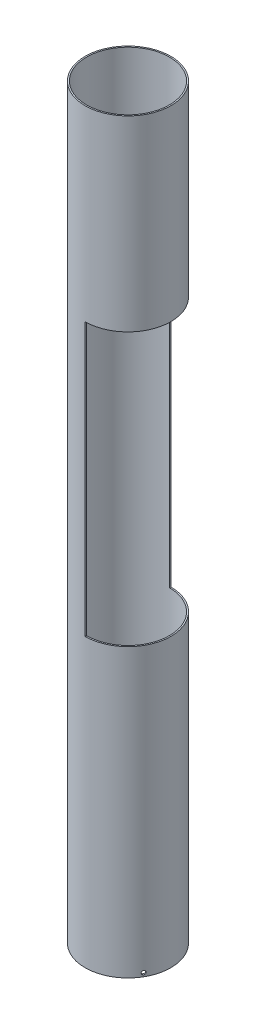
ISO-10303-21;
HEADER;
FILE_DESCRIPTION(('STEP AP214'),'2;1');
FILE_NAME('part.step','',(''),(''),'','','');
FILE_SCHEMA(('AUTOMOTIVE_DESIGN { 1 0 10303 214 1 1 1 1 }'));
ENDSEC;
DATA;
#1=APPLICATION_CONTEXT('core data for automotive mechanical design processes');
#2=APPLICATION_PROTOCOL_DEFINITION('international standard','automotive_design',2000,#1);
#3=PRODUCT_CONTEXT('',#1,'mechanical');
#4=PRODUCT('Part','Part','',(#3));
#5=PRODUCT_RELATED_PRODUCT_CATEGORY('part','',(#4));
#6=PRODUCT_DEFINITION_FORMATION('','',#4);
#7=PRODUCT_DEFINITION_CONTEXT('part definition',#1,'design');
#8=PRODUCT_DEFINITION('design','',#6,#7);
#9=PRODUCT_DEFINITION_SHAPE('','',#8);
#10=(LENGTH_UNIT() NAMED_UNIT(*) SI_UNIT(.MILLI.,.METRE.));
#11=(NAMED_UNIT(*) PLANE_ANGLE_UNIT() SI_UNIT($,.RADIAN.));
#12=(NAMED_UNIT(*) SI_UNIT($,.STERADIAN.) SOLID_ANGLE_UNIT());
#13=UNCERTAINTY_MEASURE_WITH_UNIT(LENGTH_MEASURE(1.E-05),#10,'distance_accuracy_value','');
#14=(GEOMETRIC_REPRESENTATION_CONTEXT(3) GLOBAL_UNCERTAINTY_ASSIGNED_CONTEXT((#13)) GLOBAL_UNIT_ASSIGNED_CONTEXT((#10,
#11,#12)) REPRESENTATION_CONTEXT('',''));
#15=CARTESIAN_POINT('',(0.,0.,0.));
#16=DIRECTION('',(0.,0.,1.));
#17=DIRECTION('',(1.,0.,0.));
#18=AXIS2_PLACEMENT_3D('',#15,#16,#17);
#19=CARTESIAN_POINT('',(0.,685.8,0.));
#20=DIRECTION('',(0.,-1.,0.));
#21=DIRECTION('',(0.,0.,-1.));
#22=AXIS2_PLACEMENT_3D('',#19,#20,#21);
#23=CYLINDRICAL_SURFACE('',#22,39.37);
#24=CARTESIAN_POINT('',(0.,0.,0.));
#25=DIRECTION('',(0.,1.,0.));
#26=DIRECTION('',(0.,0.,1.));
#27=AXIS2_PLACEMENT_3D('',#24,#25,#26);
#28=CIRCLE('',#27,39.37);
#29=CARTESIAN_POINT('',(0.,0.,39.37));
#30=VERTEX_POINT('',#29);
#31=EDGE_CURVE('E171',#30,#30,#28,.T.);
#32=ORIENTED_EDGE('',*,*,#31,.T.);
#33=EDGE_LOOP('',(#32));
#34=FACE_BOUND('',#33,.T.);
#35=CARTESIAN_POINT('',(0.,685.8,0.));
#36=DIRECTION('',(0.,1.,0.));
#37=DIRECTION('',(0.,0.,1.));
#38=AXIS2_PLACEMENT_3D('',#35,#36,#37);
#39=CIRCLE('',#38,39.37);
#40=CARTESIAN_POINT('',(0.,685.8,39.37));
#41=VERTEX_POINT('',#40);
#42=EDGE_CURVE('E175',#41,#41,#39,.T.);
#43=ORIENTED_EDGE('',*,*,#42,.F.);
#44=EDGE_LOOP('',(#43));
#45=FACE_BOUND('',#44,.T.);
#46=CARTESIAN_POINT('',(0.,4.98001203184509,-39.37));
#47=CARTESIAN_POINT('',(-0.0950420783106642,4.98000783183179,-39.3699995116633));
#48=CARTESIAN_POINT('',(-0.19015195208346,4.97198129213131,-39.3696521537289));
#49=CARTESIAN_POINT('',(-0.377749092701281,4.94007502605946,-39.3682998672944));
#50=CARTESIAN_POINT('',(-0.470233116585823,4.91617651595078,-39.3672941596883));
#51=CARTESIAN_POINT('',(-0.649833808346389,4.85321079913397,-39.36473902938));
#52=CARTESIAN_POINT('',(-0.736953141689522,4.81415119689102,-39.3631898792939));
#53=CARTESIAN_POINT('',(-0.90337461556956,4.72198342848802,-39.3597224451632));
#54=CARTESIAN_POINT('',(-0.98267862079702,4.66887862462239,-39.3578042494948));
#55=CARTESIAN_POINT('',(-1.13130445742555,4.55008091395807,-39.3538129080837));
#56=CARTESIAN_POINT('',(-1.20061945247711,4.48437945716689,-39.3517396576837));
#57=CARTESIAN_POINT('',(-1.3272415925757,4.34227003364836,-39.3476727832543));
#58=CARTESIAN_POINT('',(-1.38454825216813,4.26586163428542,-39.3456791624467));
#59=CARTESIAN_POINT('',(-1.48554392473161,4.10447388206962,-39.3419956723313));
#60=CARTESIAN_POINT('',(-1.52922789130311,4.01949136840869,-39.340305915685));
#61=CARTESIAN_POINT('',(-1.60170568623785,3.84339004313634,-39.3374219044769));
#62=CARTESIAN_POINT('',(-1.63049960587457,3.75227126914304,-39.3362276468776));
#63=CARTESIAN_POINT('',(-1.67236268409085,3.56654421262905,-39.3344702061846));
#64=CARTESIAN_POINT('',(-1.68544164712472,3.47193814382548,-39.3339066296283));
#65=CARTESIAN_POINT('',(-1.69553378679414,3.28187174755947,-39.3334729195219));
#66=CARTESIAN_POINT('',(-1.69254706470368,3.1864114254858,-39.3336027816005));
#67=CARTESIAN_POINT('',(-1.67060081093584,2.99741286670702,-39.3345409385238));
#68=CARTESIAN_POINT('',(-1.65165186894738,2.90387339780013,-39.3353487835783));
#69=CARTESIAN_POINT('',(-1.59833546790773,2.72130431420434,-39.3375511396038));
#70=CARTESIAN_POINT('',(-1.56396795637497,2.63227471486722,-39.3389456525716));
#71=CARTESIAN_POINT('',(-1.4807778608903,2.46121846161553,-39.3421646783245));
#72=CARTESIAN_POINT('',(-1.43195043808114,2.37919416380863,-39.3439893350109));
#73=CARTESIAN_POINT('',(-1.32123009378693,2.22450267013418,-39.3478628287787));
#74=CARTESIAN_POINT('',(-1.25933710545153,2.15183552214581,-39.349911667007));
#75=CARTESIAN_POINT('',(-1.12418272987786,2.0178594309771,-39.3540045835823));
#76=CARTESIAN_POINT('',(-1.05091216873308,1.9565597418437,-39.3560486567252));
#77=CARTESIAN_POINT('',(-0.89511481475696,1.8471299233649,-39.3599000384661));
#78=CARTESIAN_POINT('',(-0.81258802000479,1.79899979675243,-39.3617073470151));
#79=CARTESIAN_POINT('',(-0.64061552136329,1.71727628329349,-39.3648815506819));
#80=CARTESIAN_POINT('',(-0.551169669949889,1.68368320649822,-39.3662484364061));
#81=CARTESIAN_POINT('',(-0.367900459757485,1.63199336734538,-39.3683875892833));
#82=CARTESIAN_POINT('',(-0.274077125262604,1.61389651903312,-39.3691598597346));
#83=CARTESIAN_POINT('',(-0.0847966155301952,1.59372421854097,-39.3700223156438));
#84=CARTESIAN_POINT('',(0.0106591929554708,1.59163596412215,-39.3701130461352));
#85=CARTESIAN_POINT('',(0.200565637148675,1.60350673879702,-39.3696036416406));
#86=CARTESIAN_POINT('',(0.295016275300036,1.61746572886681,-39.3690035083348));
#87=CARTESIAN_POINT('',(0.480195476070679,1.66102415267996,-39.3671803383439));
#88=CARTESIAN_POINT('',(0.570925413063392,1.69061775410989,-39.3659575339454));
#89=CARTESIAN_POINT('',(0.746130008305633,1.76459943479582,-39.3630267413466));
#90=CARTESIAN_POINT('',(0.830604640035484,1.80898757676962,-39.3613187510894));
#91=CARTESIAN_POINT('',(0.990959546892861,1.91133117994094,-39.3576084769163));
#92=CARTESIAN_POINT('',(1.06683433136313,1.96929523721227,-39.3556060068403));
#93=CARTESIAN_POINT('',(1.20778055703025,2.09713270074688,-39.3515329775977));
#94=CARTESIAN_POINT('',(1.27285194594558,2.16700616464075,-39.3494624181017));
#95=CARTESIAN_POINT('',(1.39038720966608,2.31673398284631,-39.3454850513226));
#96=CARTESIAN_POINT('',(1.44284281120277,2.39659483486953,-39.3435783520206));
#97=CARTESIAN_POINT('',(1.53360094179633,2.56399753766406,-39.3401453943536));
#98=CARTESIAN_POINT('',(1.57190352041913,2.65153936153417,-39.3386191346563));
#99=CARTESIAN_POINT('',(1.63325387152443,2.83178816474908,-39.3361199248937));
#100=CARTESIAN_POINT('',(1.65630694977704,2.9244933354223,-39.3351467823986));
#101=CARTESIAN_POINT('',(1.68652127447177,3.11246268625176,-39.33386299577));
#102=CARTESIAN_POINT('',(1.69368258004302,3.20772685688532,-39.3335523491714));
#103=CARTESIAN_POINT('',(1.69190946940816,3.39802755639757,-39.333628650755));
#104=CARTESIAN_POINT('',(1.68298807591869,3.49306420711711,-39.3340150345277));
#105=CARTESIAN_POINT('',(1.64932968820657,3.68028926657918,-39.3354406540112));
#106=CARTESIAN_POINT('',(1.62459266328724,3.77247766979317,-39.3364798909891));
#107=CARTESIAN_POINT('',(1.56000766284437,3.9513926152622,-39.3390939598741));
#108=CARTESIAN_POINT('',(1.52015950497137,4.03811909159221,-39.3406687982445));
#109=CARTESIAN_POINT('',(1.42648607612367,4.20365089531175,-39.3441765014396));
#110=CARTESIAN_POINT('',(1.37266126509872,4.28245648324695,-39.3461093544819));
#111=CARTESIAN_POINT('',(1.25251738996995,4.42997353540114,-39.3501169655678));
#112=CARTESIAN_POINT('',(1.18618958482348,4.49867787750174,-39.3521918222379));
#113=CARTESIAN_POINT('',(1.0429219433514,4.6239967145901,-39.3562490325377));
#114=CARTESIAN_POINT('',(0.965979493562689,4.68060822339067,-39.3582313632249));
#115=CARTESIAN_POINT('',(0.803618694279619,4.78015395567005,-39.3618812018049));
#116=CARTESIAN_POINT('',(0.718193353798812,4.82307677316331,-39.3635484466865));
#117=CARTESIAN_POINT('',(0.541406294233834,4.89392001699157,-39.3663760344494));
#118=CARTESIAN_POINT('',(0.450051759273257,4.92185823262782,-39.3675369780901));
#119=CARTESIAN_POINT('',(0.298438107295841,4.95458011910427,-39.3689127721565));
#120=CARTESIAN_POINT('',(0.239161885859798,4.96410498233784,-39.3693187000876));
#121=CARTESIAN_POINT('',(0.119932776340874,4.97682226203223,-39.3698624680178));
#122=CARTESIAN_POINT('',(0.0599798886778428,4.98001468242191,-39.3700003081833));
#123=CARTESIAN_POINT('',(0.,4.98001203184509,-39.37));
#124=B_SPLINE_CURVE_WITH_KNOTS('',3,(#46,#47,#48,#49,#50,#51,#52,#53,#54,#55,#56,#57,#58,#59,
#60,#61,#62,#63,#64,#65,#66,#67,#68,#69,#70,#71,#72,#73,#74,#75,#76,#77,#78,#79,#80,#81,#82,#83,
#84,#85,#86,#87,#88,#89,#90,#91,#92,#93,#94,#95,#96,#97,#98,#99,#100,#101,#102,#103,#104,#105,
#106,#107,#108,#109,#110,#111,#112,#113,#114,#115,#116,#117,#118,#119,#120,#121,#122,#123),
.UNSPECIFIED.,.T.,.F.,(4,2,2,2,2,2,2,2,2,2,2,2,2,2,2,2,2,2,2,2,2,2,2,2,2,2,2,2,2,2,2,2,2,2,2,2,
2,2,4),(0.,0.284907291951242,0.570152360661547,0.855254541313081,1.14028853275696,
1.42551668068289,1.71075635715183,1.99610157282346,2.28144503935619,2.56661038945319,
2.85177394194247,3.1367484594956,3.42172394704963,3.70679490662229,3.99186732480409,
4.27717080625707,4.56247434691592,4.84778397232727,5.13309201516931,5.4181718703784,
5.70325103232804,5.98822392376052,6.2731980232806,6.55835305445107,6.84350946554916,
7.12885237168492,7.41419427849897,7.69943685379749,7.98467836778141,8.26968901560107,
8.55470021660186,8.83971485700698,9.12472011921539,9.40992537713639,9.69520098203275,
9.98071367307523,10.2658866569249,10.4456882622863,10.6254897560929),.UNSPECIFIED.);
#125=CARTESIAN_POINT('',(0.,4.98001203184509,-39.37));
#126=VERTEX_POINT('',#125);
#127=EDGE_CURVE('E179',#126,#126,#124,.T.);
#128=ORIENTED_EDGE('',*,*,#127,.T.);
#129=EDGE_LOOP('',(#128));
#130=FACE_BOUND('',#129,.T.);
#131=CARTESIAN_POINT('',(33.2174512961359,3.28714288487833,21.1328613630251));
#132=CARTESIAN_POINT('',(33.2174538205479,3.38218491738494,21.1328579706893));
#133=CARTESIAN_POINT('',(33.2217681930752,3.47729474551065,21.126080633747));
#134=CARTESIAN_POINT('',(33.2388934445685,3.6648917912808,21.0991257570981));
#135=CARTESIAN_POINT('',(33.2517143907443,3.75737576592903,21.0789323399275));
#136=CARTESIAN_POINT('',(33.2854116163837,3.9369763536157,21.02568097877));
#137=CARTESIAN_POINT('',(33.3062838568314,4.02409563253836,20.9926294851009));
#138=CARTESIAN_POINT('',(33.3553720391397,4.19051701538223,20.9145445214253));
#139=CARTESIAN_POINT('',(33.3835862234407,4.26982098392493,20.8695139189942));
#140=CARTESIAN_POINT('',(33.4464423518298,4.4184468625803,20.7686282179428));
#141=CARTESIAN_POINT('',(33.4810886687199,4.48776192457972,20.7127657542666));
#142=CARTESIAN_POINT('',(33.5556650540467,4.61438419371642,20.5917285571402));
#143=CARTESIAN_POINT('',(33.5955953358989,4.67169091560414,20.5265534475506));
#144=CARTESIAN_POINT('',(33.6794779391566,4.77268665284044,20.3886285247867));
#145=CARTESIAN_POINT('',(33.7234317398689,4.81637063336175,20.3158759242693));
#146=CARTESIAN_POINT('',(33.8139783769478,4.88884845770009,20.1648087872665));
#147=CARTESIAN_POINT('',(33.8605711971658,4.91764239262118,20.0864942848148));
#148=CARTESIAN_POINT('',(33.9549554225056,4.95950550347214,19.9265279617717));
#149=CARTESIAN_POINT('',(34.0027460612068,4.97258448495485,19.8448782551491));
#150=CARTESIAN_POINT('',(34.0981544914141,4.98267667167345,19.680492633966));
#151=CARTESIAN_POINT('',(34.1457722840059,4.97968997798896,19.5977567262428));
#152=CARTESIAN_POINT('',(34.2394598912068,4.95774376868586,19.4336104076742));
#153=CARTESIAN_POINT('',(34.2855307083884,4.93879481417567,19.3521991566899));
#154=CARTESIAN_POINT('',(34.37490958429,4.88547833548628,19.1929891139188));
#155=CARTESIAN_POINT('',(34.4182176336554,4.85111075910423,19.1151903343637));
#156=CARTESIAN_POINT('',(34.5009596753003,4.76792053040032,18.9654425262297));
#157=CARTESIAN_POINT('',(34.5403923689781,4.71909305452594,18.8934954598974));
#158=CARTESIAN_POINT('',(34.6143845938184,4.60837259753722,18.7575924822923));
#159=CARTESIAN_POINT('',(34.6489441000329,4.5464795495389,18.6936366119299));
#160=CARTESIAN_POINT('',(34.7123875129296,4.4113251322666,18.5755634988489));
#161=CARTESIAN_POINT('',(34.7412668026752,4.33805460110622,18.5214542622221));
#162=CARTESIAN_POINT('',(34.7926452104451,4.18225733210706,18.4247590777228));
#163=CARTESIAN_POINT('',(34.8151443270767,4.09973059224792,18.3821731323654));
#164=CARTESIAN_POINT('',(34.8532555182368,3.92775810714328,18.3098105015829));
#165=CARTESIAN_POINT('',(34.8688674373111,3.83831220577562,18.2800341052886));
#166=CARTESIAN_POINT('',(34.8928583269078,3.6550428872034,18.2341989882741));
#167=CARTESIAN_POINT('',(34.9012373376876,3.56121949436637,18.2181401912038));
#168=CARTESIAN_POINT('',(34.9105758749707,3.37193895962708,18.2002389044854));
#169=CARTESIAN_POINT('',(34.9115413375262,3.27648318617466,18.1983850409036));
#170=CARTESIAN_POINT('',(34.9060474900208,3.08657681934583,18.208920411737));
#171=CARTESIAN_POINT('',(34.899588198014,2.99212622352577,18.2213096115186));
#172=CARTESIAN_POINT('',(34.879389207629,2.80694722254543,18.2599446463407));
#173=CARTESIAN_POINT('',(34.8656522323883,2.71621743881703,18.2861852984811));
#174=CARTESIAN_POINT('',(34.831201232923,2.54101313126621,18.3517215337401));
#175=CARTESIAN_POINT('',(34.8104871790039,2.45653863406829,18.391017172421));
#176=CARTESIAN_POINT('',(34.7625298844432,2.29618381557865,18.4815050721675));
#177=CARTESIAN_POINT('',(34.7352824952791,2.22030900015793,18.5327048914938));
#178=CARTESIAN_POINT('',(34.6748914378453,2.07936270340621,18.6454520636411));
#179=CARTESIAN_POINT('',(34.6417477411147,2.01429127422503,18.7069994664088));
#180=CARTESIAN_POINT('',(34.5703275693102,1.89675592818081,18.8386558243499));
#181=CARTESIAN_POINT('',(34.5320477514916,1.84430028467192,18.9087703525935));
#182=CARTESIAN_POINT('',(34.4513179067664,1.75354208033435,19.0554610035425));
#183=CARTESIAN_POINT('',(34.4088678944655,1.71523946993862,19.1320371036169));
#184=CARTESIAN_POINT('',(34.3209062996509,1.6538890967604,19.2893858168249));
#185=CARTESIAN_POINT('',(34.2753957908424,1.63083601447108,19.3701569559842));
#186=CARTESIAN_POINT('',(34.1825219936844,1.6006216620792,19.533584414318));
#187=CARTESIAN_POINT('',(34.1351587121937,1.59346033315357,19.6162407265134));
#188=CARTESIAN_POINT('',(34.0399423248748,1.59523337767018,19.7810078905008));
#189=CARTESIAN_POINT('',(33.9920896455457,1.60415475616211,19.8631191289154));
#190=CARTESIAN_POINT('',(33.8972434528362,1.63781315173865,20.0245487830765));
#191=CARTESIAN_POINT('',(33.850249941113,1.66255019932711,20.1038671934362));
#192=CARTESIAN_POINT('',(33.758530117058,1.72713528475596,20.2575061608741));
#193=CARTESIAN_POINT('',(33.7138038320892,1.76698350492273,20.3318266576365));
#194=CARTESIAN_POINT('',(33.6280015194782,1.86065709050227,20.4734285430828));
#195=CARTESIAN_POINT('',(33.5869253717463,1.91448199585274,20.540710163359));
#196=CARTESIAN_POINT('',(33.5096968051586,2.03462597249464,20.6664602377637));
#197=CARTESIAN_POINT('',(33.4735478530767,2.10095376341906,20.7249224896427));
#198=CARTESIAN_POINT('',(33.4073744260692,2.2442213476446,20.8314228152268));
#199=CARTESIAN_POINT('',(33.3773514640614,2.32116375456164,20.8794583140535));
#200=CARTESIAN_POINT('',(33.3244164552602,2.48352452120396,20.9638417046183));
#201=CARTESIAN_POINT('',(33.301510345427,2.56894987953958,21.0001798391867));
#202=CARTESIAN_POINT('',(33.2636383410865,2.74573697740927,21.0601171211081));
#203=CARTESIAN_POINT('',(33.2486630314987,2.83709153272086,21.0837313742503));
#204=CARTESIAN_POINT('',(33.2311096380607,2.98870513701385,21.1113808381931));
#205=CARTESIAN_POINT('',(33.2259953610197,3.04798128677177,21.1194264469216));
#206=CARTESIAN_POINT('',(33.2191653945528,3.16721025258049,21.1301677781028));
#207=CARTESIAN_POINT('',(33.2174497030117,3.22716306821015,21.132863503885));
#208=CARTESIAN_POINT('',(33.2174512961359,3.28714288487833,21.1328613630251));
#209=B_SPLINE_CURVE_WITH_KNOTS('',3,(#131,#132,#133,#134,#135,#136,#137,#138,#139,#140,#141,
#142,#143,#144,#145,#146,#147,#148,#149,#150,#151,#152,#153,#154,#155,#156,#157,#158,#159,#160,
#161,#162,#163,#164,#165,#166,#167,#168,#169,#170,#171,#172,#173,#174,#175,#176,#177,#178,#179,
#180,#181,#182,#183,#184,#185,#186,#187,#188,#189,#190,#191,#192,#193,#194,#195,#196,#197,#198,
#199,#200,#201,#202,#203,#204,#205,#206,#207,#208),.UNSPECIFIED.,.T.,.F.,(4,2,2,2,2,2,2,2,2,2,2,
2,2,2,2,2,2,2,2,2,2,2,2,2,2,2,2,2,2,2,2,2,2,2,2,2,2,2,4),(0.,0.284907154392816,
0.570152088539903,0.855254112292125,1.14028794925074,1.42551627711697,1.71075612866084,
1.99610127736488,2.28144468017745,2.56660994659131,2.85177341884691,3.1367483664877,
3.42172427897576,3.70679536139441,3.99186790315575,4.27717120578255,4.56247457068296,
4.84778437497278,5.13309259126105,5.4181723364922,5.70325138852219,5.98822384595427,
6.27319751625019,6.55835261992712,6.84350910005751,7.12885207722146,7.41419405504167,
7.69943644419612,7.9846777775289,8.26968873698255,8.55470024614147,8.83971519426367,
9.12472076190602,9.40992583553519,9.69520126040553,9.98071403029439,10.2658870884428,
10.4456884781288,10.6254897559134),.UNSPECIFIED.);
#210=CARTESIAN_POINT('',(33.2174512961359,3.28714288487833,21.1328613630251));
#211=VERTEX_POINT('',#210);
#212=EDGE_CURVE('E101',#211,#211,#209,.T.);
#213=ORIENTED_EDGE('',*,*,#212,.T.);
#214=EDGE_LOOP('',(#213));
#215=FACE_BOUND('',#214,.T.);
#216=CARTESIAN_POINT('',(-34.9103204431024,3.28714288487833,18.2007259899133));
#217=CARTESIAN_POINT('',(-34.9103187674594,3.38218491738494,18.2007298722861));
#218=CARTESIAN_POINT('',(-34.906606607761,3.47729474551065,18.2078548969673));
#219=CARTESIAN_POINT('',(-34.8918256255739,3.6648917912808,18.2361632381312));
#220=CARTESIAN_POINT('',(-34.8807480864028,3.75737576592903,18.2573632118053));
#221=CARTESIAN_POINT('',(-34.851479667674,3.9369763536157,18.3131715458248));
#222=CARTESIAN_POINT('',(-34.8332923547473,4.02409563253836,18.3477731831209));
#223=CARTESIAN_POINT('',(-34.7902128837049,4.19051701538223,18.4293272778634));
#224=CARTESIAN_POINT('',(-34.7653223302024,4.26982098392493,18.4762767794306));
#225=CARTESIAN_POINT('',(-34.7093808144077,4.4184468625803,18.5811546339248));
#226=CARTESIAN_POINT('',(-34.6783256601913,4.48776192457972,18.6390904563373));
#227=CARTESIAN_POINT('',(-34.6107925653403,4.61438419371642,18.764194099116));
#228=CARTESIAN_POINT('',(-34.5743144056674,4.67169091560414,18.831362292375));
#229=CARTESIAN_POINT('',(-34.4968092203678,4.77268665284044,18.9729692191137));
#230=CARTESIAN_POINT('',(-34.4557805204844,4.81637063336175,19.0474106273821));
#231=CARTESIAN_POINT('',(-34.3702258607025,4.88884845770009,19.2013598838211));
#232=CARTESIAN_POINT('',(-34.3256999222036,4.91764239262118,19.2808677009896));
#233=CARTESIAN_POINT('',(-34.2343571353681,4.95950550347214,19.4425899993721));
#234=CARTESIAN_POINT('',(-34.187541734572,4.97258448495485,19.5248027598616));
#235=CARTESIAN_POINT('',(-34.0928838257142,4.98267667167345,19.6896216947479));
#236=CARTESIAN_POINT('',(-34.0450413241167,4.97968997798896,19.7722278666661));
#237=CARTESIAN_POINT('',(-33.949730245899,4.95774376868586,19.9354368738062));
#238=CARTESIAN_POINT('',(-33.9022614429835,4.93879481417567,20.0160409973508));
#239=CARTESIAN_POINT('',(-33.8090709393569,4.88547833548627,20.1730503958287));
#240=CARTESIAN_POINT('',(-33.7633492445615,4.85111075910423,20.2494556565451));
#241=CARTESIAN_POINT('',(-33.6750348593789,4.76792053040032,20.3959862706376));
#242=CARTESIAN_POINT('',(-33.6324432190463,4.71909305452594,20.4661095182684));
#243=CARTESIAN_POINT('',(-33.5517439004104,4.60837259753722,20.5981401534651));
#244=CARTESIAN_POINT('',(-33.5136362450627,4.5464795495389,20.6600474989703));
#245=CARTESIAN_POINT('',(-33.443103636079,4.4113251322666,20.7740276627822));
#246=CARTESIAN_POINT('',(-33.4106833074537,4.33805460110622,20.8260924796585));
#247=CARTESIAN_POINT('',(-33.3526320251385,4.18225733210706,20.9189350782428));
#248=CARTESIAN_POINT('',(-33.3270010729306,4.09973059224792,20.9597128574872));
#249=CARTESIAN_POINT('',(-33.2833887919683,3.92775810714328,21.0288994325916));
#250=CARTESIAN_POINT('',(-33.2654076358815,3.83831220577562,21.0573079492589));
#251=CARTESIAN_POINT('',(-33.2377087049599,3.6550428872034,21.1010022276163));
#252=CARTESIAN_POINT('',(-33.2279908841327,3.56121949436637,21.1162880623453));
#253=CARTESIAN_POINT('',(-33.2171571837157,3.37193895962708,21.133326116226));
#254=CARTESIAN_POINT('',(-33.2160344220365,3.27648318617467,21.1350891631163));
#255=CARTESIAN_POINT('',(-33.2224113970638,3.08657681934583,21.1250636661954));
#256=CARTESIAN_POINT('',(-33.2299111128037,2.99212622352577,21.1132751553363));
#257=CARTESIAN_POINT('',(-33.2532705392433,2.80694722254543,21.076464799121));
#258=CARTESIAN_POINT('',(-33.2691271229884,2.71621743881703,21.0514479035212));
#259=CARTESIAN_POINT('',(-33.3086576678585,2.54101313126621,20.988844345169));
#260=CARTESIAN_POINT('',(-33.3323316622545,2.45653863406829,20.9512576289193));
#261=CARTESIAN_POINT('',(-33.3867178348898,2.29618381557865,20.8644814436597));
#262=CARTESIAN_POINT('',(-33.4174344845134,2.22030900015793,20.8152846027935));
#263=CARTESIAN_POINT('',(-33.4848808710809,2.07936270340621,20.7066108268208));
#264=CARTESIAN_POINT('',(-33.5216106370494,2.01429127422503,20.6471338420929));
#265=CARTESIAN_POINT('',(-33.5999183016939,1.89675592818081,20.519453979997));
#266=CARTESIAN_POINT('',(-33.6414993554179,1.84430028467192,20.4512454211921));
#267=CARTESIAN_POINT('',(-33.7281722632748,1.75354208033435,20.307985999342));
#268=CARTESIAN_POINT('',(-33.7732641051115,1.71523946993862,20.2329351602613));
#269=CARTESIAN_POINT('',(-33.8655512905951,1.6538890967604,20.0780838279904));
#270=CARTESIAN_POINT('',(-33.9127458945955,1.63083601447108,19.9982850016434));
#271=CARTESIAN_POINT('',(-34.0078413266095,1.6006216620792,19.8361402047918));
#272=CARTESIAN_POINT('',(-34.0557421520085,1.59346033315357,19.7537942437166));
#273=CARTESIAN_POINT('',(-34.1508265080716,1.59523337767018,19.5889508514481));
#274=CARTESIAN_POINT('',(-34.1980105868103,1.60415475616211,19.5064535963027));
#275=CARTESIAN_POINT('',(-34.2903896718832,1.63781315173865,19.3435995568835));
#276=CARTESIAN_POINT('',(-34.3355846743809,1.66255019932711,19.2632427767383));
#277=CARTESIAN_POINT('',(-34.4227800111659,1.72713528475596,19.1069915953571));
#278=CARTESIAN_POINT('',(-34.4647803068996,1.76698350492273,19.031097247976));
#279=CARTESIAN_POINT('',(-34.5445099806143,1.86065709050227,18.8859893228283));
#280=CARTESIAN_POINT('',(-34.5822394991153,1.91448199585274,18.8167755252648));
#281=CARTESIAN_POINT('',(-34.6525279747838,2.03462597249464,18.6870185874995));
#282=CARTESIAN_POINT('',(-34.6850832940325,2.10095376341906,18.626481550737));
#283=CARTESIAN_POINT('',(-34.7442285679959,2.2442213476446,18.5159235191009));
#284=CARTESIAN_POINT('',(-34.7708170492594,2.32116375456164,18.465905121892));
#285=CARTESIAN_POINT('',(-34.8174277047453,2.48352452120395,18.3778703642382));
#286=CARTESIAN_POINT('',(-34.837444397491,2.56894987953958,18.3398640239366));
#287=CARTESIAN_POINT('',(-34.8704156040986,2.74573697740927,18.2770972651248));
#288=CARTESIAN_POINT('',(-34.8833784924172,2.83709153272086,18.2523211400211));
#289=CARTESIAN_POINT('',(-34.8985469338737,2.98870513701385,18.2232947234098));
#290=CARTESIAN_POINT('',(-34.902957496901,3.04798128677177,18.214842825206));
#291=CARTESIAN_POINT('',(-34.9088447793408,3.1672102525805,18.2035572351481));
#292=CARTESIAN_POINT('',(-34.9103215005794,3.22716306821015,18.2007235397973));
#293=CARTESIAN_POINT('',(-34.9103204431024,3.28714288487833,18.2007259899133));
#294=B_SPLINE_CURVE_WITH_KNOTS('',3,(#216,#217,#218,#219,#220,#221,#222,#223,#224,#225,#226,
#227,#228,#229,#230,#231,#232,#233,#234,#235,#236,#237,#238,#239,#240,#241,#242,#243,#244,#245,
#246,#247,#248,#249,#250,#251,#252,#253,#254,#255,#256,#257,#258,#259,#260,#261,#262,#263,#264,
#265,#266,#267,#268,#269,#270,#271,#272,#273,#274,#275,#276,#277,#278,#279,#280,#281,#282,#283,
#284,#285,#286,#287,#288,#289,#290,#291,#292,#293),.UNSPECIFIED.,.T.,.F.,(4,2,2,2,2,2,2,2,2,2,2,
2,2,2,2,2,2,2,2,2,2,2,2,2,2,2,2,2,2,2,2,2,2,2,2,2,2,2,4),(0.,0.284907154392816,
0.570152088539902,0.855254112292124,1.14028794925074,1.42551627711697,1.71075612866084,
1.99610127736487,2.28144468017746,2.56660994659132,2.85177341884692,3.13674836648771,
3.42172427897577,3.70679536139442,3.99186790315575,4.27717120578255,4.56247457068296,
4.84778437497278,5.13309259126105,5.4181723364922,5.70325138852219,5.98822384595427,
6.27319751625019,6.55835261992713,6.84350910005751,7.12885207722146,7.41419405504167,
7.69943644419613,7.9846777775289,8.26968873698256,8.55470024614147,8.83971519426367,
9.12472076190603,9.40992583553519,9.69520126040553,9.98071403029439,10.2658870884428,
10.4456884781288,10.6254897559134),.UNSPECIFIED.);
#295=CARTESIAN_POINT('',(-34.9103204431024,3.28714288487833,18.2007259899133));
#296=VERTEX_POINT('',#295);
#297=EDGE_CURVE('E113',#296,#296,#294,.T.);
#298=ORIENTED_EDGE('',*,*,#297,.T.);
#299=EDGE_LOOP('',(#298));
#300=FACE_BOUND('',#299,.T.);
#301=CARTESIAN_POINT('',(0.,263.60502844564,0.));
#302=DIRECTION('',(0.,1.,0.));
#303=DIRECTION('',(0.,0.,1.));
#304=AXIS2_PLACEMENT_3D('',#301,#302,#303);
#305=CIRCLE('',#304,39.37);
#306=CARTESIAN_POINT('',(0.,263.60502844564,39.37));
#307=VERTEX_POINT('',#306);
#308=CARTESIAN_POINT('',(0.,263.60502844564,-39.37));
#309=VERTEX_POINT('',#308);
#310=EDGE_CURVE('E92',#307,#309,#305,.T.);
#311=ORIENTED_EDGE('',*,*,#310,.F.);
#312=DIRECTION('',(0.,-1.,0.));
#313=VECTOR('',#312,1.);
#314=CARTESIAN_POINT('',(0.,269.95502844564,39.37));
#315=LINE('',#314,#313);
#316=CARTESIAN_POINT('',(0.,513.990392655002,39.37));
#317=VERTEX_POINT('',#316);
#318=EDGE_CURVE('E80',#317,#307,#315,.T.);
#319=ORIENTED_EDGE('',*,*,#318,.F.);
#320=CARTESIAN_POINT('',(0.,513.990392655002,0.));
#321=DIRECTION('',(0.,-1.,0.));
#322=DIRECTION('',(0.,0.,-1.));
#323=AXIS2_PLACEMENT_3D('',#320,#321,#322);
#324=CIRCLE('',#323,39.37);
#325=CARTESIAN_POINT('',(0.,513.990392655002,-39.37));
#326=VERTEX_POINT('',#325);
#327=EDGE_CURVE('E98',#326,#317,#324,.T.);
#328=ORIENTED_EDGE('',*,*,#327,.F.);
#329=DIRECTION('',(0.,1.,0.));
#330=VECTOR('',#329,1.);
#331=CARTESIAN_POINT('',(0.,513.990392655002,-39.37));
#332=LINE('',#331,#330);
#333=EDGE_CURVE('E95',#309,#326,#332,.T.);
#334=ORIENTED_EDGE('',*,*,#333,.F.);
#335=EDGE_LOOP('',(#311,#319,#328,#334));
#336=FACE_BOUND('',#335,.T.);
#337=ADVANCED_FACE('F39',(#34,#45,#130,#215,#300,#336),#23,.T.);
#338=CARTESIAN_POINT('',(0.,685.8,0.));
#339=DIRECTION('',(0.,-1.,0.));
#340=DIRECTION('',(0.,0.,-1.));
#341=AXIS2_PLACEMENT_3D('',#338,#339,#340);
#342=CYLINDRICAL_SURFACE('',#341,38.1);
#343=CARTESIAN_POINT('',(-33.8094160153741,3.28714288487833,17.5651185222123));
#344=CARTESIAN_POINT('',(-33.8094143543288,3.38218171940621,17.5651224116475));
#345=CARTESIAN_POINT('',(-33.8057124993749,3.47728827138197,17.5722527645965));
#346=CARTESIAN_POINT('',(-33.7909717083435,3.66487863560934,17.6005816987345));
#347=CARTESIAN_POINT('',(-33.7799240881283,3.75735920834741,17.6217969309731));
#348=CARTESIAN_POINT('',(-33.7507318963243,3.93695297469838,17.6776436072991));
#349=CARTESIAN_POINT('',(-33.7325908945791,4.02406884268773,17.7122683028025));
#350=CARTESIAN_POINT('',(-33.6896153878106,4.19048407914288,17.793873419736));
#351=CARTESIAN_POINT('',(-33.6647824804593,4.26978530716657,17.8408508919135));
#352=CARTESIAN_POINT('',(-33.6089602010448,4.41840984755649,17.9457883133733));
#353=CARTESIAN_POINT('',(-33.5779663999485,4.48772591945836,18.0037561621849));
#354=CARTESIAN_POINT('',(-33.5105536276877,4.61435094283753,18.1289226827243));
#355=CARTESIAN_POINT('',(-33.4741344369646,4.67165940815599,18.1961217280185));
#356=CARTESIAN_POINT('',(-33.3967371011577,4.77266075250482,18.3377877223142));
#357=CARTESIAN_POINT('',(-33.3557571587441,4.8163482377267,18.4122575351968));
#358=CARTESIAN_POINT('',(-33.2702851206148,4.88883280444153,18.566256363971));
#359=CARTESIAN_POINT('',(-33.2257930473694,4.91762998119241,18.6457853474939));
#360=CARTESIAN_POINT('',(-33.1345012139446,4.95949803368491,18.8075368757998));
#361=CARTESIAN_POINT('',(-33.0877030120023,4.97257938086054,18.8897575895234));
#362=CARTESIAN_POINT('',(-32.9930592616569,4.98267674704841,19.0545813470321));
#363=CARTESIAN_POINT('',(-32.9452137201636,4.97969287201821,19.1371843882919));
#364=CARTESIAN_POINT('',(-32.8498789990916,4.95775321464979,19.3003724287752));
#365=CARTESIAN_POINT('',(-32.8023895917886,4.93880870889598,19.3809588114367));
#366=CARTESIAN_POINT('',(-32.7091406148927,4.88550302673365,19.5379236234456));
#367=CARTESIAN_POINT('',(-32.6633810514267,4.85114179572601,19.6143020378892));
#368=CARTESIAN_POINT('',(-32.5749768863395,4.76796516527169,19.7607745155725));
#369=CARTESIAN_POINT('',(-32.5323334008888,4.71914461787257,19.8308663289938));
#370=CARTESIAN_POINT('',(-32.4515230945298,4.60843896285516,19.9628316015512));
#371=CARTESIAN_POINT('',(-32.4133562982144,4.54655378347126,20.0247050155396));
#372=CARTESIAN_POINT('',(-32.3427024898681,4.41141178428608,20.1386221655671));
#373=CARTESIAN_POINT('',(-32.3102204155867,4.33814518181172,20.1906573592482));
#374=CARTESIAN_POINT('',(-32.2520520220997,4.18235451337957,20.2834451964729));
#375=CARTESIAN_POINT('',(-32.226365704435,4.09983044532286,20.3241978374585));
#376=CARTESIAN_POINT('',(-32.1826551014858,3.92786157285979,20.3933418576518));
#377=CARTESIAN_POINT('',(-32.164631002952,3.83841659983362,20.4217329355727));
#378=CARTESIAN_POINT('',(-32.1368634226269,3.65514755994837,20.4654021395383));
#379=CARTESIAN_POINT('',(-32.1271198916347,3.56132351911199,20.4806803434961));
#380=CARTESIAN_POINT('',(-32.116255086806,3.3720455770027,20.4977136144868));
#381=CARTESIAN_POINT('',(-32.1151264477047,3.27659313792258,20.4994802331938));
#382=CARTESIAN_POINT('',(-32.1215111298582,3.08669244071317,20.4894742880325));
#383=CARTESIAN_POINT('',(-32.1290244286443,2.99224417997369,20.4777017593654));
#384=CARTESIAN_POINT('',(-32.1524282504509,2.80707123663987,20.4409350882779));
#385=CARTESIAN_POINT('',(-32.1683154255608,2.71634508154551,20.4159462297875));
#386=CARTESIAN_POINT('',(-32.2079203372339,2.54114641442029,20.3534083030556));
#387=CARTESIAN_POINT('',(-32.2316381094359,2.45667393085346,20.3158591776495));
#388=CARTESIAN_POINT('',(-32.2861208694576,2.2963174738089,20.2291624196945));
#389=CARTESIAN_POINT('',(-32.3168906364198,2.22043937710063,20.1800069208106));
#390=CARTESIAN_POINT('',(-32.3844454331766,2.07948468035869,20.0714167908587));
#391=CARTESIAN_POINT('',(-32.4212304938175,2.01440813571881,20.0119821070789));
#392=CARTESIAN_POINT('',(-32.4996463274479,1.89685793159992,19.8843805434919));
#393=CARTESIAN_POINT('',(-32.5412804673483,1.84439310732713,19.8162075930123));
#394=CARTESIAN_POINT('',(-32.6280497160245,1.75361601658056,19.6730112325568));
#395=CARTESIAN_POINT('',(-32.6731848119641,1.71530369821927,19.5979878476979));
#396=CARTESIAN_POINT('',(-32.7655426315996,1.65393463895175,19.4431820960052));
#397=CARTESIAN_POINT('',(-32.8127645716929,1.63087222282248,19.3634015116181));
#398=CARTESIAN_POINT('',(-32.9078965480536,1.6006390338024,19.2012805431304));
#399=CARTESIAN_POINT('',(-32.9558065815164,1.59346819615504,19.118940169462));
#400=CARTESIAN_POINT('',(-33.0508874048496,1.59522236985813,18.9540994911211));
#401=CARTESIAN_POINT('',(-33.098058796523,1.60413350764556,18.8715993855717));
#402=CARTESIAN_POINT('',(-33.1903945169769,1.63777003621175,18.7087273467006));
#403=CARTESIAN_POINT('',(-33.2355588419023,1.66249545736471,18.6283554174668));
#404=CARTESIAN_POINT('',(-33.3226782280633,1.72705601867957,18.4720634230048));
#405=CARTESIAN_POINT('',(-33.3646332531732,1.76689132889724,18.3961434078923));
#406=CARTESIAN_POINT('',(-33.4442631263542,1.86053812233139,18.2509760499012));
#407=CARTESIAN_POINT('',(-33.4819381134211,1.91434915149468,18.1817284903433));
#408=CARTESIAN_POINT('',(-33.552116602201,2.03446825423532,18.051895512812));
#409=CARTESIAN_POINT('',(-33.5846161811861,2.10078572476307,17.9913166688307));
#410=CARTESIAN_POINT('',(-33.6436533571872,2.24403418213553,17.8806748410163));
#411=CARTESIAN_POINT('',(-33.6701894823227,2.32096778167332,17.830614453513));
#412=CARTESIAN_POINT('',(-33.7167057370272,2.48331508295238,17.7424983244335));
#413=CARTESIAN_POINT('',(-33.7366802321291,2.56873599119792,17.7044529011761));
#414=CARTESIAN_POINT('',(-33.7695817920667,2.74551705756376,17.6416160113135));
#415=CARTESIAN_POINT('',(-33.7825172076443,2.83687003351814,17.6168088403184));
#416=CARTESIAN_POINT('',(-33.7976591812901,2.9885186077328,17.5877338778882));
#417=CARTESIAN_POINT('',(-33.8020635322326,3.04783124385015,17.5792645536546));
#418=CARTESIAN_POINT('',(-33.8079424727784,3.16713454664704,17.5679556495913));
#419=CARTESIAN_POINT('',(-33.8094170643355,3.22712521287441,17.5651160660074));
#420=CARTESIAN_POINT('',(-33.8094160153741,3.28714288487833,17.5651185222123));
#421=B_SPLINE_CURVE_WITH_KNOTS('',3,(#343,#344,#345,#346,#347,#348,#349,#350,#351,#352,#353,
#354,#355,#356,#357,#358,#359,#360,#361,#362,#363,#364,#365,#366,#367,#368,#369,#370,#371,#372,
#373,#374,#375,#376,#377,#378,#379,#380,#381,#382,#383,#384,#385,#386,#387,#388,#389,#390,#391,
#392,#393,#394,#395,#396,#397,#398,#399,#400,#401,#402,#403,#404,#405,#406,#407,#408,#409,#410,
#411,#412,#413,#414,#415,#416,#417,#418,#419,#420),.UNSPECIFIED.,.T.,.F.,(4,2,2,2,2,2,2,2,2,2,2,
2,2,2,2,2,2,2,2,2,2,2,2,2,2,2,2,2,2,2,2,2,2,2,2,2,2,2,4),(0.,0.284897421068616,
0.570132247117116,0.855223709117989,1.14024716660771,1.42547627182562,1.71071692304668,
1.99607038443798,2.28142202031205,2.56658342117854,2.8517429412762,3.13670115784063,
3.42166038360708,3.70672118565538,3.99178355361806,4.2770923109407,4.56240113295053,
4.84771690836882,5.13303098850811,5.41810111325181,5.70317049682575,5.98812599482824,
6.27308278974644,6.55823327417049,6.84338522089151,7.12873635388354,7.41408644067904,
7.69933027511054,7.98457294720043,8.26956966438797,8.55456692896495,8.83956740116733,
9.12455861522756,9.40976482218329,9.69504134570129,9.98056219949313,10.2657435858873,
10.4456583697757,10.6255730336855),.UNSPECIFIED.);
#422=CARTESIAN_POINT('',(-33.8094160153741,3.28714288487833,17.5651185222123));
#423=VERTEX_POINT('',#422);
#424=EDGE_CURVE('E112',#423,#423,#421,.T.);
#425=ORIENTED_EDGE('',*,*,#424,.F.);
#426=EDGE_LOOP('',(#425));
#427=FACE_BOUND('',#426,.T.);
#428=CARTESIAN_POINT('',(32.1165468684076,3.28714288487833,20.4972538953241));
#429=CARTESIAN_POINT('',(32.1165494062347,3.38218171940621,20.4972505120991));
#430=CARTESIAN_POINT('',(32.1208735455494,3.47728827138197,20.4904794351934));
#431=CARTESIAN_POINT('',(32.1380367266594,3.66487863560934,20.4635490686194));
#432=CARTESIAN_POINT('',(32.1508858466176,3.7573592083474,20.4433739327423));
#433=CARTESIAN_POINT('',(32.1846543911308,3.93695297469838,20.3901694148849));
#434=CARTESIAN_POINT('',(32.2055697561625,4.02406884268773,20.3571464987718));
#435=CARTESIAN_POINT('',(32.2547541071215,4.19048407914288,20.2791260597029));
#436=CARTESIAN_POINT('',(32.2830213377571,4.26978530716657,20.2341313949982));
#437=CARTESIAN_POINT('',(32.3459886708417,4.41840984755649,20.1333191721982));
#438=CARTESIAN_POINT('',(32.380693399967,4.48772591945837,20.0774938286831));
#439=CARTESIAN_POINT('',(32.4553844003271,4.61435094283753,19.956529395096));
#440=CARTESIAN_POINT('',(32.4953708853004,4.67165940815599,19.8913899280974));
#441=CARTESIAN_POINT('',(32.5793585673095,4.77266075250482,19.7535288719556));
#442=CARTESIAN_POINT('',(32.623361345874,4.8163482377267,19.6808042943385));
#443=CARTESIAN_POINT('',(32.7139922246809,4.88883280444153,19.5297839236182));
#444=CARTESIAN_POINT('',(32.7606203081261,4.91762998119241,19.4514881661592));
#445=CARTESIAN_POINT('',(32.8550553240276,4.95949803368491,19.2915513551023));
#446=CARTESIAN_POINT('',(32.9028614498584,4.97257938086054,19.209912566507));
#447=CARTESIAN_POINT('',(32.9982811358354,4.98267674704841,19.0455367956441));
#448=CARTESIAN_POINT('',(33.0458946972497,4.97969287201821,18.9627998206232));
#449=CARTESIAN_POINT('',(33.139552325366,4.95775321464979,18.7986435100705));
#450=CARTESIAN_POINT('',(33.1855974762985,4.93880870889598,18.7172232856047));
#451=CARTESIAN_POINT('',(33.2749085025505,4.88550302673365,18.5579848967315));
#452=CARTESIAN_POINT('',(33.3181743680264,4.85114179572601,18.4801667450821));
#453=CARTESIAN_POINT('',(33.4008211721117,4.76796516527169,18.3303702534745));
#454=CARTESIAN_POINT('',(33.4402007204066,4.71914461787258,18.2583940050576));
#455=CARTESIAN_POINT('',(33.5140808456791,4.60843896285516,18.1224275905845));
#456=CARTESIAN_POINT('',(33.5485813958542,4.54655378347126,18.0584374684));
#457=CARTESIAN_POINT('',(33.6119096375316,4.41141178428608,17.9402909004843));
#458=CARTESIAN_POINT('',(33.6407324000096,4.33814518181172,17.8861430021484));
#459=CARTESIAN_POINT('',(33.6920048274649,4.18235451337957,17.789373777079));
#460=CARTESIAN_POINT('',(33.7144544909974,4.09983044532286,17.7467524529589));
#461=CARTESIAN_POINT('',(33.75247966753,3.92786157285979,17.6743259502935));
#462=CARTESIAN_POINT('',(33.7680550129834,3.83841659983362,17.6445210841225));
#463=CARTESIAN_POINT('',(33.7919898628181,3.65514755994837,17.5986390521765));
#464=CARTESIAN_POINT('',(33.8003494100737,3.56132351911199,17.5825618048358));
#465=CARTESIAN_POINT('',(33.8096682530468,3.3720455770027,17.5646359723516));
#466=CARTESIAN_POINT('',(33.8106338701752,3.27659313792258,17.5627752328647));
#467=CARTESIAN_POINT('',(33.8051608085534,3.08669244071317,17.5733075023854));
#468=CARTESIAN_POINT('',(33.798722149054,2.99224417997369,17.5857004743339));
#469=CARTESIAN_POINT('',(33.7785831887829,2.80707123663987,17.6243521141078));
#470=CARTESIAN_POINT('',(33.7648857900736,2.71634508154551,17.6506052405926));
#471=CARTESIAN_POINT('',(33.7305288126603,2.54114641442029,17.7161730635821));
#472=CARTESIAN_POINT('',(33.7098692022697,2.45667393085346,17.7554878195333));
#473=CARTESIAN_POINT('',(33.6620289874658,2.2963174738089,17.8460196527578));
#474=CARTESIAN_POINT('',(33.6348439601778,2.22043937710063,17.8972448020576));
#475=CARTESIAN_POINT('',(33.5745795474175,2.07948468035869,18.0100440371724));
#476=CARTESIAN_POINT('',(33.5415001317189,2.01440813571881,18.0716181760571));
#477=CARTESIAN_POINT('',(33.470201852905,1.89685793159992,18.2033290618334));
#478=CARTESIAN_POINT('',(33.431979415889,1.84439310732713,18.2734717598916));
#479=CARTESIAN_POINT('',(33.3513523543432,1.75361601658056,18.4202143137403));
#480=CARTESIAN_POINT('',(33.3089477451472,1.71530369821927,18.4968141458557));
#481=CARTESIAN_POINT('',(33.2210609413472,1.65393463895175,18.6542012397445));
#482=CARTESIAN_POINT('',(33.1755798985858,1.63087222282248,18.7349869316748));
#483=CARTESIAN_POINT('',(33.0827450095697,1.6006390338024,18.8984341241593));
#484=CARTESIAN_POINT('',(33.0353911709471,1.59346819615504,18.9810956170684));
#485=CARTESIAN_POINT('',(32.9401753675934,1.59522236985813,19.1458583646582));
#486=CARTESIAN_POINT('',(32.8923138762095,1.60413350764556,19.2279600409539));
#487=CARTESIAN_POINT('',(32.7974304132079,1.63777003621175,19.3893611399793));
#488=CARTESIAN_POINT('',(32.7504084432029,1.66249545736471,19.4686605573264));
#489=CARTESIAN_POINT('',(32.6586152986712,1.72705601867957,19.6222541561349));
#490=CARTESIAN_POINT('',(32.6138441494831,1.76689132889724,19.6965482812527));
#491=CARTESIAN_POINT('',(32.527940466253,1.86053812233139,19.8380934533231));
#492=CARTESIAN_POINT('',(32.4868078140592,1.91434915149468,19.9053447289893));
#493=CARTESIAN_POINT('',(32.4094584016581,2.03446825423532,20.0310375718376));
#494=CARTESIAN_POINT('',(32.3732453733309,2.10078572476307,20.0894724548416));
#495=CARTESIAN_POINT('',(32.3069453277231,2.24403418213553,20.1959210629335));
#496=CARTESIAN_POINT('',(32.2768598229897,2.32096778167332,20.2439322151704));
#497=CARTESIAN_POINT('',(32.2238071440759,2.48331508295238,20.3282745379732));
#498=CARTESIAN_POINT('',(32.2008460885883,2.56873599119792,20.3645956697879));
#499=CARTESIAN_POINT('',(32.1628785256412,2.74551705756376,20.4245077014493));
#500=CARTESIAN_POINT('',(32.1478625931523,2.83687003351814,20.4481136854455));
#501=CARTESIAN_POINT('',(32.1302539238965,2.9885186077328,20.4757645005013));
#502=CARTESIAN_POINT('',(32.1251214494286,3.04783124385015,20.4838134424215));
#503=CARTESIAN_POINT('',(32.1182671214938,3.16713454664704,20.4945592063132));
#504=CARTESIAN_POINT('',(32.1165452657525,3.22712521287441,20.4972560318538));
#505=CARTESIAN_POINT('',(32.1165468684076,3.28714288487833,20.4972538953241));
#506=B_SPLINE_CURVE_WITH_KNOTS('',3,(#428,#429,#430,#431,#432,#433,#434,#435,#436,#437,#438,
#439,#440,#441,#442,#443,#444,#445,#446,#447,#448,#449,#450,#451,#452,#453,#454,#455,#456,#457,
#458,#459,#460,#461,#462,#463,#464,#465,#466,#467,#468,#469,#470,#471,#472,#473,#474,#475,#476,
#477,#478,#479,#480,#481,#482,#483,#484,#485,#486,#487,#488,#489,#490,#491,#492,#493,#494,#495,
#496,#497,#498,#499,#500,#501,#502,#503,#504,#505),.UNSPECIFIED.,.T.,.F.,(4,2,2,2,2,2,2,2,2,2,2,
2,2,2,2,2,2,2,2,2,2,2,2,2,2,2,2,2,2,2,2,2,2,2,2,2,2,2,4),(0.,0.284897421068615,
0.570132247117116,0.855223709117991,1.14024716660771,1.42547627182563,1.71071692304668,
1.99607038443798,2.28142202031205,2.56658342117855,2.8517429412762,3.13670115784062,
3.42166038360708,3.70672118565538,3.99178355361806,4.2770923109407,4.56240113295053,
4.84771690836882,5.13303098850811,5.41810111325181,5.70317049682575,5.98812599482824,
6.27308278974644,6.55823327417049,6.84338522089151,7.12873635388353,7.41408644067904,
7.69933027511054,7.98457294720043,8.26956966438796,8.55456692896494,8.83956740116732,
9.12455861522756,9.40976482218329,9.69504134570129,9.98056219949312,10.2657435858873,
10.4456583697757,10.6255730336855),.UNSPECIFIED.);
#507=CARTESIAN_POINT('',(32.1165468684076,3.28714288487833,20.4972538953241));
#508=VERTEX_POINT('',#507);
#509=EDGE_CURVE('E97',#508,#508,#506,.T.);
#510=ORIENTED_EDGE('',*,*,#509,.F.);
#511=EDGE_LOOP('',(#510));
#512=FACE_BOUND('',#511,.T.);
#513=CARTESIAN_POINT('',(0.,4.98001203184509,-38.1));
#514=CARTESIAN_POINT('',(-0.095038886749371,4.98000783302019,-38.099999495663));
#515=CARTESIAN_POINT('',(-0.190145490767848,4.97198183022983,-38.0996405834848));
#516=CARTESIAN_POINT('',(-0.377735963132156,4.94007782116006,-38.0982433157144));
#517=CARTESIAN_POINT('',(-0.470216592005159,4.9161810527565,-38.0972041559669));
#518=CARTESIAN_POINT('',(-0.649810477012617,4.85322023384327,-38.0945640304031));
#519=CARTESIAN_POINT('',(-0.736926407047969,4.8141638113533,-38.0929633471725));
#520=CARTESIAN_POINT('',(-0.903341747298269,4.72200382245889,-38.0893805415347));
#521=CARTESIAN_POINT('',(-0.982643017149835,4.66890360915669,-38.0873985102092));
#522=CARTESIAN_POINT('',(-1.1312675096319,4.55011392086052,-38.0832742077211));
#523=CARTESIAN_POINT('',(-1.20058350520839,4.4844154069553,-38.081131822186));
#524=CARTESIAN_POINT('',(-1.32720838147173,4.3423116989233,-38.0769292625709));
#525=CARTESIAN_POINT('',(-1.38451677576599,4.26590607129199,-38.0748690918239));
#526=CARTESIAN_POINT('',(-1.48551804637145,4.10452109491669,-38.0710625140599));
#527=CARTESIAN_POINT('',(-1.52920551568273,4.01953835905473,-38.0693162317612));
#528=CARTESIAN_POINT('',(-1.60169004886614,3.8434354097528,-38.0663356862091));
#529=CARTESIAN_POINT('',(-1.63048720818937,3.75231523565976,-38.0651014196736));
#530=CARTESIAN_POINT('',(-1.67235522348358,3.56658833578245,-38.0632850853971));
#531=CARTESIAN_POINT('',(-1.68543654963167,3.47198397458177,-38.0627025834562));
#532=CARTESIAN_POINT('',(-1.6955338621853,3.281920473011,-38.0622541593181));
#533=CARTESIAN_POINT('',(-1.69254995477005,3.18646133829448,-38.0623882323847));
#534=CARTESIAN_POINT('',(-1.67061024669918,2.99746913346092,-38.0633574353134));
#535=CARTESIAN_POINT('',(-1.6516657552122,2.90393474758828,-38.0641920687787));
#536=CARTESIAN_POINT('',(-1.59836016155319,2.72137508181897,-38.0664675339931));
#537=CARTESIAN_POINT('',(-1.56399900446438,2.63234981798583,-38.0679083679017));
#538=CARTESIAN_POINT('',(-1.48082252587965,2.46129904673705,-38.071234402702));
#539=CARTESIAN_POINT('',(-1.43200203898921,2.37927605429807,-38.0731197623453));
#540=CARTESIAN_POINT('',(-1.3212965124843,2.22458567950508,-38.0771221748619));
#541=CARTESIAN_POINT('',(-1.25941140114243,2.15191834851905,-38.0792392290071));
#542=CARTESIAN_POINT('',(-1.12426944952315,2.01793621951088,-38.0834686114221));
#543=CARTESIAN_POINT('',(-1.05100281286151,1.95663130206048,-38.0855809340155));
#544=CARTESIAN_POINT('',(-0.895212047533734,1.84719033470601,-38.0895609937921));
#545=CARTESIAN_POINT('',(-0.812687916882267,1.79905428762611,-38.0914287309229));
#546=CARTESIAN_POINT('',(-0.640719028958987,1.71731846100158,-38.0947091699406));
#547=CARTESIAN_POINT('',(-0.551274112872953,1.68371901515124,-38.0961218613815));
#548=CARTESIAN_POINT('',(-0.368005196527594,1.63201656375095,-38.0983328289201));
#549=CARTESIAN_POINT('',(-0.274181222195831,1.61391346646237,-38.0991311086552));
#550=CARTESIAN_POINT('',(-0.0849033086300692,1.59372974708539,-38.1000228125663));
#551=CARTESIAN_POINT('',(0.0105491703474827,1.59163545644338,-38.1001168380436));
#552=CARTESIAN_POINT('',(0.200449955671119,1.60349314564147,-38.0995910312709));
#553=CARTESIAN_POINT('',(0.29489826462759,1.61744508375835,-38.0989712008771));
#554=CARTESIAN_POINT('',(0.480071435711669,1.66098787376151,-38.0970878964339));
#555=CARTESIAN_POINT('',(0.570797765555785,1.69057249595139,-38.0958246787847));
#556=CARTESIAN_POINT('',(0.745996760714215,1.7645345404534,-38.0927968612964));
#557=CARTESIAN_POINT('',(0.830469397683946,1.80891202980852,-38.0910322591852));
#558=CARTESIAN_POINT('',(0.990825955551466,1.91123515966756,-38.0871987733915));
#559=CARTESIAN_POINT('',(1.06670401701829,1.96918997502174,-38.0851296843057));
#560=CARTESIAN_POINT('',(1.20765863279391,2.09700920688587,-38.080920984895));
#561=CARTESIAN_POINT('',(1.27273513155891,2.16687368463393,-38.0787813742076));
#562=CARTESIAN_POINT('',(1.39028524180615,2.3165877763043,-38.0746710918993));
#563=CARTESIAN_POINT('',(1.44275001819174,2.39644433093549,-38.0727005393294));
#564=CARTESIAN_POINT('',(1.53352702480404,2.56384058431548,-38.069152439002));
#565=CARTESIAN_POINT('',(1.57183930691675,2.65138025489493,-38.0675748898036));
#566=CARTESIAN_POINT('',(1.63320834102259,2.8316249044197,-38.0649915293678));
#567=CARTESIAN_POINT('',(1.65627075256611,2.92432795326157,-38.0639855060447));
#568=CARTESIAN_POINT('',(1.68650391003653,3.11229495738087,-38.0626580398882));
#569=CARTESIAN_POINT('',(1.69367472106907,3.20755890216505,-38.0623365942502));
#570=CARTESIAN_POINT('',(1.69192047198128,3.39785547892499,-38.0624146052731));
#571=CARTESIAN_POINT('',(1.68300931707419,3.49288823965635,-38.0628134391471));
#572=CARTESIAN_POINT('',(1.64937279740876,3.68010717432064,-38.0642857401542));
#573=CARTESIAN_POINT('',(1.62464740205654,3.77229334274627,-38.0653592085923));
#574=CARTESIAN_POINT('',(1.56008693756644,3.95120562787351,-38.068059650578));
#575=CARTESIAN_POINT('',(1.5202516983649,4.03793168310789,-38.0696866303554));
#576=CARTESIAN_POINT('',(1.42660508363525,4.20346503118765,-38.0733106518777));
#577=CARTESIAN_POINT('',(1.37279416203188,4.28227258110773,-38.075307681603));
#578=CARTESIAN_POINT('',(1.25267517508784,4.42980049348173,-38.0794486422573));
#579=CARTESIAN_POINT('',(1.18635768838006,4.49851318146112,-38.0815926831519));
#580=CARTESIAN_POINT('',(1.04310916581142,4.62385055823833,-38.0857853571931));
#581=CARTESIAN_POINT('',(0.966175517431785,4.68047226281577,-38.0878339666885));
#582=CARTESIAN_POINT('',(0.80382817892602,4.78004127399501,-38.0916060871233));
#583=CARTESIAN_POINT('',(0.718407290982937,4.82297684162049,-38.0933293184632));
#584=CARTESIAN_POINT('',(0.541626268167158,4.89384600203572,-38.0962520920448));
#585=CARTESIAN_POINT('',(0.450273315347653,4.92179737032796,-38.0974522544767));
#586=CARTESIAN_POINT('',(0.298624686739086,4.95454807204482,-38.0988751225915));
#587=CARTESIAN_POINT('',(0.23931196893913,4.96408492387061,-38.0992951055371));
#588=CARTESIAN_POINT('',(0.12000850237547,4.97681822745801,-38.0998577033954));
#589=CARTESIAN_POINT('',(0.0600177540624486,4.98001468343381,-38.1000003184925));
#590=CARTESIAN_POINT('',(0.,4.98001203184509,-38.1));
#591=B_SPLINE_CURVE_WITH_KNOTS('',3,(#513,#514,#515,#516,#517,#518,#519,#520,#521,#522,#523,
#524,#525,#526,#527,#528,#529,#530,#531,#532,#533,#534,#535,#536,#537,#538,#539,#540,#541,#542,
#543,#544,#545,#546,#547,#548,#549,#550,#551,#552,#553,#554,#555,#556,#557,#558,#559,#560,#561,
#562,#563,#564,#565,#566,#567,#568,#569,#570,#571,#572,#573,#574,#575,#576,#577,#578,#579,#580,
#581,#582,#583,#584,#585,#586,#587,#588,#589,#590),.UNSPECIFIED.,.T.,.F.,(4,2,2,2,2,2,2,2,2,2,2,
2,2,2,2,2,2,2,2,2,2,2,2,2,2,2,2,2,2,2,2,2,2,2,2,2,2,2,4),(0.,0.284897577900377,
0.570132557364847,0.855224198246731,1.14024783186548,1.42547673193003,1.71071718354509,
1.99607072125338,2.28142242974194,2.56658392606532,2.85174353768657,3.13670126393324,
3.42166000525567,3.70672066716468,3.99178289415426,4.27709185541713,4.56240087786688,
4.84771644936749,5.13303033178363,5.41810058178826,5.70317009055804,5.98812608339839,
6.27308336770992,6.55823376959378,6.84338563773269,7.1287366895936,7.41408669528735,
7.69933074201752,7.98457362014114,8.26956998220306,8.55456689561429,8.83956701680579,
9.12455788246124,9.40976429948419,9.69504102820476,9.98056179228558,10.2657430941513,
10.4456581238106,10.6255730338885),.UNSPECIFIED.);
#592=CARTESIAN_POINT('',(0.,4.98001203184509,-38.1));
#593=VERTEX_POINT('',#592);
#594=EDGE_CURVE('E136',#593,#593,#591,.T.);
#595=ORIENTED_EDGE('',*,*,#594,.F.);
#596=EDGE_LOOP('',(#595));
#597=FACE_BOUND('',#596,.T.);
#598=CARTESIAN_POINT('',(0.,685.8,0.));
#599=DIRECTION('',(0.,1.,0.));
#600=DIRECTION('',(0.,0.,1.));
#601=AXIS2_PLACEMENT_3D('',#598,#599,#600);
#602=CIRCLE('',#601,38.1);
#603=CARTESIAN_POINT('',(0.,685.8,38.1));
#604=VERTEX_POINT('',#603);
#605=EDGE_CURVE('E197',#604,#604,#602,.T.);
#606=ORIENTED_EDGE('',*,*,#605,.T.);
#607=EDGE_LOOP('',(#606));
#608=FACE_BOUND('',#607,.T.);
#609=CARTESIAN_POINT('',(0.,0.,0.));
#610=DIRECTION('',(0.,1.,0.));
#611=DIRECTION('',(0.,0.,1.));
#612=AXIS2_PLACEMENT_3D('',#609,#610,#611);
#613=CIRCLE('',#612,38.1);
#614=CARTESIAN_POINT('',(0.,0.,38.1));
#615=VERTEX_POINT('',#614);
#616=EDGE_CURVE('E201',#615,#615,#613,.T.);
#617=ORIENTED_EDGE('',*,*,#616,.F.);
#618=EDGE_LOOP('',(#617));
#619=FACE_BOUND('',#618,.T.);
#620=CARTESIAN_POINT('',(0.,513.990392655002,0.));
#621=DIRECTION('',(0.,-1.,0.));
#622=DIRECTION('',(0.,0.,-1.));
#623=AXIS2_PLACEMENT_3D('',#620,#621,#622);
#624=CIRCLE('',#623,38.1);
#625=CARTESIAN_POINT('',(0.,513.990392655002,-38.1));
#626=VERTEX_POINT('',#625);
#627=CARTESIAN_POINT('',(0.,513.990392655002,38.1));
#628=VERTEX_POINT('',#627);
#629=EDGE_CURVE('E204',#626,#628,#624,.T.);
#630=ORIENTED_EDGE('',*,*,#629,.T.);
#631=DIRECTION('',(0.,-1.,0.));
#632=VECTOR('',#631,1.);
#633=CARTESIAN_POINT('',(0.,685.8,38.1));
#634=LINE('',#633,#632);
#635=CARTESIAN_POINT('',(0.,263.60502844564,38.1));
#636=VERTEX_POINT('',#635);
#637=EDGE_CURVE('E11',#628,#636,#634,.T.);
#638=ORIENTED_EDGE('',*,*,#637,.T.);
#639=CARTESIAN_POINT('',(0.,263.60502844564,0.));
#640=DIRECTION('',(0.,1.,0.));
#641=DIRECTION('',(0.,0.,1.));
#642=AXIS2_PLACEMENT_3D('',#639,#640,#641);
#643=CIRCLE('',#642,38.1);
#644=CARTESIAN_POINT('',(0.,263.60502844564,-38.1));
#645=VERTEX_POINT('',#644);
#646=EDGE_CURVE('E47',#636,#645,#643,.T.);
#647=ORIENTED_EDGE('',*,*,#646,.T.);
#648=DIRECTION('',(0.,-1.,0.));
#649=VECTOR('',#648,1.);
#650=CARTESIAN_POINT('',(0.,685.8,-38.1));
#651=LINE('',#650,#649);
#652=EDGE_CURVE('E205',#645,#626,#651,.F.);
#653=ORIENTED_EDGE('',*,*,#652,.T.);
#654=EDGE_LOOP('',(#630,#638,#647,#653));
#655=FACE_BOUND('',#654,.T.);
#656=ADVANCED_FACE('F145',(#427,#512,#597,#608,#619,#655),#342,.F.);
#657=CARTESIAN_POINT('',(0.,685.8,0.));
#658=DIRECTION('',(0.,1.,0.));
#659=DIRECTION('',(0.,0.,1.));
#660=AXIS2_PLACEMENT_3D('',#657,#658,#659);
#661=PLANE('',#660);
#662=ORIENTED_EDGE('',*,*,#42,.T.);
#663=EDGE_LOOP('',(#662));
#664=FACE_BOUND('',#663,.T.);
#665=ORIENTED_EDGE('',*,*,#605,.F.);
#666=EDGE_LOOP('',(#665));
#667=FACE_BOUND('',#666,.T.);
#668=ADVANCED_FACE('F149',(#664,#667),#661,.T.);
#669=CARTESIAN_POINT('',(0.,0.,0.));
#670=DIRECTION('',(0.,1.,0.));
#671=DIRECTION('',(0.,0.,1.));
#672=AXIS2_PLACEMENT_3D('',#669,#670,#671);
#673=PLANE('',#672);
#674=ORIENTED_EDGE('',*,*,#31,.F.);
#675=EDGE_LOOP('',(#674));
#676=FACE_BOUND('',#675,.T.);
#677=ORIENTED_EDGE('',*,*,#616,.T.);
#678=EDGE_LOOP('',(#677));
#679=FACE_BOUND('',#678,.T.);
#680=ADVANCED_FACE('F155',(#676,#679),#673,.F.);
#681=CARTESIAN_POINT('',(0.,3.28714288487833,-61.3999999999995));
#682=DIRECTION('',(0.,0.,1.));
#683=DIRECTION('',(1.,0.,0.));
#684=AXIS2_PLACEMENT_3D('',#681,#682,#683);
#685=CYLINDRICAL_SURFACE('',#684,1.69286914696678);
#686=ORIENTED_EDGE('',*,*,#594,.T.);
#687=EDGE_LOOP('',(#686));
#688=FACE_BOUND('',#687,.T.);
#689=ORIENTED_EDGE('',*,*,#127,.F.);
#690=EDGE_LOOP('',(#689));
#691=FACE_BOUND('',#690,.T.);
#692=ADVANCED_FACE('F124',(#688,#691),#685,.F.);
#693=CARTESIAN_POINT('',(53.1739597923644,3.28714288487833,30.6999999999992));
#694=DIRECTION('',(-0.866025403784443,0.,-0.499999999999992));
#695=DIRECTION('',(-0.499999999999992,0.,0.866025403784443));
#696=AXIS2_PLACEMENT_3D('',#693,#694,#695);
#697=CYLINDRICAL_SURFACE('',#696,1.69286914696678);
#698=ORIENTED_EDGE('',*,*,#509,.T.);
#699=EDGE_LOOP('',(#698));
#700=FACE_BOUND('',#699,.T.);
#701=ORIENTED_EDGE('',*,*,#212,.F.);
#702=EDGE_LOOP('',(#701));
#703=FACE_BOUND('',#702,.T.);
#704=ADVANCED_FACE('F119',(#700,#703),#697,.F.);
#705=CARTESIAN_POINT('',(-53.1739597923639,3.28714288487833,30.7));
#706=DIRECTION('',(0.866025403784436,0.,-0.500000000000004));
#707=DIRECTION('',(-0.500000000000004,0.,-0.866025403784436));
#708=AXIS2_PLACEMENT_3D('',#705,#706,#707);
#709=CYLINDRICAL_SURFACE('',#708,1.69286914696678);
#710=ORIENTED_EDGE('',*,*,#424,.T.);
#711=EDGE_LOOP('',(#710));
#712=FACE_BOUND('',#711,.T.);
#713=ORIENTED_EDGE('',*,*,#297,.F.);
#714=EDGE_LOOP('',(#713));
#715=FACE_BOUND('',#714,.T.);
#716=ADVANCED_FACE('F123',(#712,#715),#709,.F.);
#717=CARTESIAN_POINT('',(72.3999999999995,263.60502844564,39.37));
#718=DIRECTION('',(0.,1.,0.));
#719=DIRECTION('',(0.,0.,1.));
#720=AXIS2_PLACEMENT_3D('',#717,#718,#719);
#721=PLANE('',#720);
#722=ORIENTED_EDGE('',*,*,#310,.T.);
#723=DIRECTION('',(0.,0.,-1.));
#724=VECTOR('',#723,1.);
#725=CARTESIAN_POINT('',(0.,263.60502844564,39.37));
#726=LINE('',#725,#724);
#727=EDGE_CURVE('E54',#645,#309,#726,.T.);
#728=ORIENTED_EDGE('',*,*,#727,.F.);
#729=ORIENTED_EDGE('',*,*,#646,.F.);
#730=EDGE_CURVE('E83',#307,#636,#726,.T.);
#731=ORIENTED_EDGE('',*,*,#730,.F.);
#732=EDGE_LOOP('',(#722,#728,#729,#731));
#733=FACE_BOUND('',#732,.T.);
#734=ADVANCED_FACE('F91',(#733),#721,.T.);
#735=CARTESIAN_POINT('',(72.3999999999995,513.990392655002,39.37));
#736=DIRECTION('',(0.,-1.,0.));
#737=DIRECTION('',(0.,0.,-1.));
#738=AXIS2_PLACEMENT_3D('',#735,#736,#737);
#739=PLANE('',#738);
#740=ORIENTED_EDGE('',*,*,#327,.T.);
#741=DIRECTION('',(0.,0.,1.));
#742=VECTOR('',#741,1.);
#743=CARTESIAN_POINT('',(0.,513.990392655002,39.37));
#744=LINE('',#743,#742);
#745=EDGE_CURVE('E85',#628,#317,#744,.T.);
#746=ORIENTED_EDGE('',*,*,#745,.F.);
#747=ORIENTED_EDGE('',*,*,#629,.F.);
#748=EDGE_CURVE('E59',#326,#626,#744,.T.);
#749=ORIENTED_EDGE('',*,*,#748,.F.);
#750=EDGE_LOOP('',(#740,#746,#747,#749));
#751=FACE_BOUND('',#750,.T.);
#752=ADVANCED_FACE('F215',(#751),#739,.T.);
#753=CARTESIAN_POINT('',(0.,0.,0.));
#754=DIRECTION('',(1.,0.,0.));
#755=DIRECTION('',(0.,0.,-1.));
#756=AXIS2_PLACEMENT_3D('',#753,#754,#755);
#757=PLANE('',#756);
#758=ORIENTED_EDGE('',*,*,#745,.T.);
#759=ORIENTED_EDGE('',*,*,#318,.T.);
#760=ORIENTED_EDGE('',*,*,#730,.T.);
#761=ORIENTED_EDGE('',*,*,#637,.F.);
#762=EDGE_LOOP('',(#758,#759,#760,#761));
#763=FACE_BOUND('',#762,.T.);
#764=ADVANCED_FACE('F82',(#763),#757,.T.);
#765=ORIENTED_EDGE('',*,*,#727,.T.);
#766=ORIENTED_EDGE('',*,*,#333,.T.);
#767=ORIENTED_EDGE('',*,*,#748,.T.);
#768=ORIENTED_EDGE('',*,*,#652,.F.);
#769=EDGE_LOOP('',(#765,#766,#767,#768));
#770=FACE_BOUND('',#769,.T.);
#771=ADVANCED_FACE('F217',(#770),#757,.T.);
#772=CLOSED_SHELL('',(#337,#656,#668,#680,#692,#704,#716,#734,#752,#764,#771));
#773=MANIFOLD_SOLID_BREP('B2',#772);
#774=ADVANCED_BREP_SHAPE_REPRESENTATION('',(#18,#773),#14);
#775=SHAPE_DEFINITION_REPRESENTATION(#9,#774);
ENDSEC;
END-ISO-10303-21;
